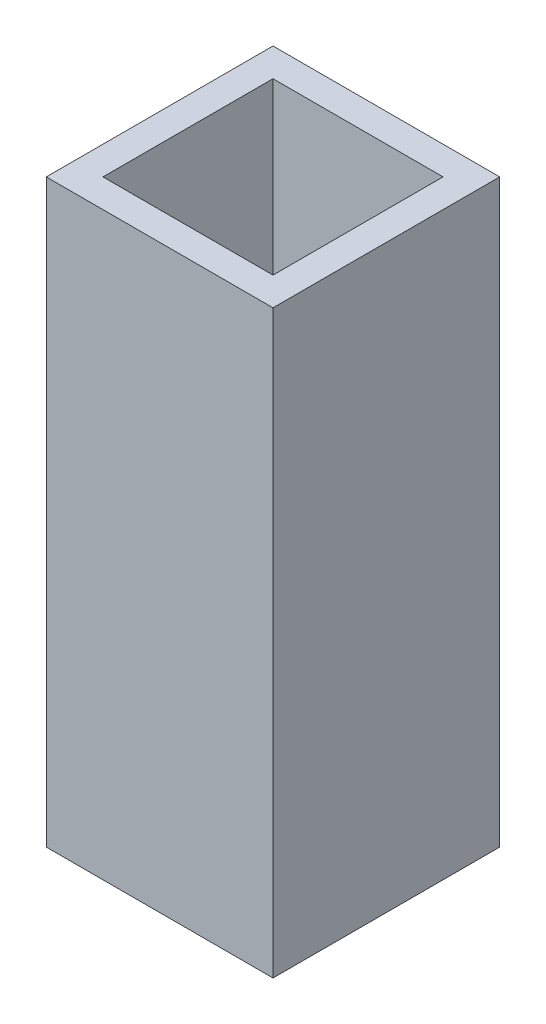
ISO-10303-21;
HEADER;
FILE_DESCRIPTION(('STEP AP214'),'2;1');
FILE_NAME('part.step','',(''),(''),'','','');
FILE_SCHEMA(('AUTOMOTIVE_DESIGN { 1 0 10303 214 1 1 1 1 }'));
ENDSEC;
DATA;
#1=APPLICATION_CONTEXT('core data for automotive mechanical design processes');
#2=APPLICATION_PROTOCOL_DEFINITION('international standard','automotive_design',2000,#1);
#3=PRODUCT_CONTEXT('',#1,'mechanical');
#4=PRODUCT('Part','Part','',(#3));
#5=PRODUCT_RELATED_PRODUCT_CATEGORY('part','',(#4));
#6=PRODUCT_DEFINITION_FORMATION('','',#4);
#7=PRODUCT_DEFINITION_CONTEXT('part definition',#1,'design');
#8=PRODUCT_DEFINITION('design','',#6,#7);
#9=PRODUCT_DEFINITION_SHAPE('','',#8);
#10=(LENGTH_UNIT() NAMED_UNIT(*) SI_UNIT(.MILLI.,.METRE.));
#11=(NAMED_UNIT(*) PLANE_ANGLE_UNIT() SI_UNIT($,.RADIAN.));
#12=(NAMED_UNIT(*) SI_UNIT($,.STERADIAN.) SOLID_ANGLE_UNIT());
#13=UNCERTAINTY_MEASURE_WITH_UNIT(LENGTH_MEASURE(1.E-05),#10,'distance_accuracy_value','');
#14=(GEOMETRIC_REPRESENTATION_CONTEXT(3) GLOBAL_UNCERTAINTY_ASSIGNED_CONTEXT((#13)) GLOBAL_UNIT_ASSIGNED_CONTEXT((#10,
#11,#12)) REPRESENTATION_CONTEXT('',''));
#15=CARTESIAN_POINT('',(0.,0.,0.));
#16=DIRECTION('',(0.,0.,1.));
#17=DIRECTION('',(1.,0.,0.));
#18=AXIS2_PLACEMENT_3D('',#15,#16,#17);
#19=CARTESIAN_POINT('',(0.,65.0240000000001,0.));
#20=DIRECTION('',(1.,0.,0.));
#21=DIRECTION('',(0.,0.,-1.));
#22=AXIS2_PLACEMENT_3D('',#19,#20,#21);
#23=PLANE('',#22);
#24=DIRECTION('',(0.,0.,1.));
#25=VECTOR('',#24,1.);
#26=CARTESIAN_POINT('',(0.,0.,0.));
#27=LINE('',#26,#25);
#28=CARTESIAN_POINT('',(0.,0.,-25.4));
#29=VERTEX_POINT('',#28);
#30=CARTESIAN_POINT('',(0.,0.,0.));
#31=VERTEX_POINT('',#30);
#32=EDGE_CURVE('E160',#29,#31,#27,.T.);
#33=ORIENTED_EDGE('',*,*,#32,.T.);
#34=DIRECTION('',(0.,-1.,0.));
#35=VECTOR('',#34,1.);
#36=CARTESIAN_POINT('',(0.,65.0240000000001,0.));
#37=LINE('',#36,#35);
#38=CARTESIAN_POINT('',(0.,65.0240000000001,0.));
#39=VERTEX_POINT('',#38);
#40=EDGE_CURVE('E11',#39,#31,#37,.T.);
#41=ORIENTED_EDGE('',*,*,#40,.F.);
#42=DIRECTION('',(0.,0.,1.));
#43=VECTOR('',#42,1.);
#44=CARTESIAN_POINT('',(0.,65.0240000000001,0.));
#45=LINE('',#44,#43);
#46=CARTESIAN_POINT('',(0.,65.0240000000001,-25.4));
#47=VERTEX_POINT('',#46);
#48=EDGE_CURVE('E166',#47,#39,#45,.T.);
#49=ORIENTED_EDGE('',*,*,#48,.F.);
#50=DIRECTION('',(0.,-1.,0.));
#51=VECTOR('',#50,1.);
#52=CARTESIAN_POINT('',(0.,65.0240000000001,-25.4));
#53=LINE('',#52,#51);
#54=EDGE_CURVE('E179',#47,#29,#53,.T.);
#55=ORIENTED_EDGE('',*,*,#54,.T.);
#56=EDGE_LOOP('',(#33,#41,#49,#55));
#57=FACE_BOUND('',#56,.T.);
#58=ADVANCED_FACE('F41',(#57),#23,.F.);
#59=CARTESIAN_POINT('',(0.,65.0240000000001,0.));
#60=DIRECTION('',(0.,0.,-1.));
#61=DIRECTION('',(-1.,0.,0.));
#62=AXIS2_PLACEMENT_3D('',#59,#60,#61);
#63=PLANE('',#62);
#64=DIRECTION('',(1.,0.,0.));
#65=VECTOR('',#64,1.);
#66=CARTESIAN_POINT('',(0.,0.,0.));
#67=LINE('',#66,#65);
#68=CARTESIAN_POINT('',(25.4,0.,0.));
#69=VERTEX_POINT('',#68);
#70=EDGE_CURVE('E183',#31,#69,#67,.T.);
#71=ORIENTED_EDGE('',*,*,#70,.T.);
#72=DIRECTION('',(0.,-1.,0.));
#73=VECTOR('',#72,1.);
#74=CARTESIAN_POINT('',(25.4,65.024,0.));
#75=LINE('',#74,#73);
#76=CARTESIAN_POINT('',(25.4,65.024,0.));
#77=VERTEX_POINT('',#76);
#78=EDGE_CURVE('E49',#77,#69,#75,.T.);
#79=ORIENTED_EDGE('',*,*,#78,.F.);
#80=DIRECTION('',(1.,0.,0.));
#81=VECTOR('',#80,1.);
#82=CARTESIAN_POINT('',(0.,65.0240000000001,0.));
#83=LINE('',#82,#81);
#84=EDGE_CURVE('E170',#39,#77,#83,.T.);
#85=ORIENTED_EDGE('',*,*,#84,.F.);
#86=ORIENTED_EDGE('',*,*,#40,.T.);
#87=EDGE_LOOP('',(#71,#79,#85,#86));
#88=FACE_BOUND('',#87,.T.);
#89=ADVANCED_FACE('F217',(#88),#63,.F.);
#90=CARTESIAN_POINT('',(25.4,65.024,0.));
#91=DIRECTION('',(-1.,0.,0.));
#92=DIRECTION('',(0.,0.,1.));
#93=AXIS2_PLACEMENT_3D('',#90,#91,#92);
#94=PLANE('',#93);
#95=DIRECTION('',(0.,0.,-1.));
#96=VECTOR('',#95,1.);
#97=CARTESIAN_POINT('',(25.4,0.,0.));
#98=LINE('',#97,#96);
#99=CARTESIAN_POINT('',(25.4,0.,-25.4));
#100=VERTEX_POINT('',#99);
#101=EDGE_CURVE('E186',#69,#100,#98,.T.);
#102=ORIENTED_EDGE('',*,*,#101,.T.);
#103=DIRECTION('',(0.,-1.,0.));
#104=VECTOR('',#103,1.);
#105=CARTESIAN_POINT('',(25.4,65.024,-25.4));
#106=LINE('',#105,#104);
#107=CARTESIAN_POINT('',(25.4,65.024,-25.4));
#108=VERTEX_POINT('',#107);
#109=EDGE_CURVE('E194',#108,#100,#106,.T.);
#110=ORIENTED_EDGE('',*,*,#109,.F.);
#111=DIRECTION('',(0.,0.,-1.));
#112=VECTOR('',#111,1.);
#113=CARTESIAN_POINT('',(25.4,65.024,0.));
#114=LINE('',#113,#112);
#115=EDGE_CURVE('E173',#77,#108,#114,.T.);
#116=ORIENTED_EDGE('',*,*,#115,.F.);
#117=ORIENTED_EDGE('',*,*,#78,.T.);
#118=EDGE_LOOP('',(#102,#110,#116,#117));
#119=FACE_BOUND('',#118,.T.);
#120=ADVANCED_FACE('F203',(#119),#94,.F.);
#121=CARTESIAN_POINT('',(0.,65.0240000000001,-25.4));
#122=DIRECTION('',(0.,0.,1.));
#123=DIRECTION('',(1.,0.,0.));
#124=AXIS2_PLACEMENT_3D('',#121,#122,#123);
#125=PLANE('',#124);
#126=DIRECTION('',(-1.,0.,0.));
#127=VECTOR('',#126,1.);
#128=CARTESIAN_POINT('',(0.,0.,-25.4));
#129=LINE('',#128,#127);
#130=EDGE_CURVE('E171',#100,#29,#129,.T.);
#131=ORIENTED_EDGE('',*,*,#130,.T.);
#132=ORIENTED_EDGE('',*,*,#54,.F.);
#133=DIRECTION('',(-1.,0.,0.));
#134=VECTOR('',#133,1.);
#135=CARTESIAN_POINT('',(0.,65.0240000000001,-25.4));
#136=LINE('',#135,#134);
#137=EDGE_CURVE('E176',#108,#47,#136,.T.);
#138=ORIENTED_EDGE('',*,*,#137,.F.);
#139=ORIENTED_EDGE('',*,*,#109,.T.);
#140=EDGE_LOOP('',(#131,#132,#138,#139));
#141=FACE_BOUND('',#140,.T.);
#142=ADVANCED_FACE('F212',(#141),#125,.F.);
#143=CARTESIAN_POINT('',(0.,65.0240000000001,0.));
#144=DIRECTION('',(0.,-1.,0.));
#145=DIRECTION('',(0.,0.,-1.));
#146=AXIS2_PLACEMENT_3D('',#143,#144,#145);
#147=PLANE('',#146);
#148=DIRECTION('',(1.,0.,0.));
#149=VECTOR('',#148,1.);
#150=CARTESIAN_POINT('',(22.225,65.024,-22.225));
#151=LINE('',#150,#149);
#152=CARTESIAN_POINT('',(3.17499999999991,65.0240000000001,-22.225));
#153=VERTEX_POINT('',#152);
#154=CARTESIAN_POINT('',(22.225,65.024,-22.225));
#155=VERTEX_POINT('',#154);
#156=EDGE_CURVE('E127',#153,#155,#151,.T.);
#157=ORIENTED_EDGE('',*,*,#156,.T.);
#158=DIRECTION('',(0.,0.,1.));
#159=VECTOR('',#158,1.);
#160=CARTESIAN_POINT('',(22.225,65.024,-3.17500000000001));
#161=LINE('',#160,#159);
#162=CARTESIAN_POINT('',(22.225,65.024,-3.17500000000001));
#163=VERTEX_POINT('',#162);
#164=EDGE_CURVE('E120',#155,#163,#161,.T.);
#165=ORIENTED_EDGE('',*,*,#164,.T.);
#166=DIRECTION('',(-1.,0.,0.));
#167=VECTOR('',#166,1.);
#168=CARTESIAN_POINT('',(22.225,65.024,-3.17500000000001));
#169=LINE('',#168,#167);
#170=CARTESIAN_POINT('',(3.17499999999998,65.024,-3.17500000000001));
#171=VERTEX_POINT('',#170);
#172=EDGE_CURVE('E130',#163,#171,#169,.T.);
#173=ORIENTED_EDGE('',*,*,#172,.T.);
#174=DIRECTION('',(0.,0.,-1.));
#175=VECTOR('',#174,1.);
#176=CARTESIAN_POINT('',(3.17499999999998,65.024,-3.17500000000001));
#177=LINE('',#176,#175);
#178=EDGE_CURVE('E56',#171,#153,#177,.T.);
#179=ORIENTED_EDGE('',*,*,#178,.T.);
#180=EDGE_LOOP('',(#157,#165,#173,#179));
#181=FACE_BOUND('',#180,.T.);
#182=ORIENTED_EDGE('',*,*,#48,.T.);
#183=ORIENTED_EDGE('',*,*,#84,.T.);
#184=ORIENTED_EDGE('',*,*,#115,.T.);
#185=ORIENTED_EDGE('',*,*,#137,.T.);
#186=EDGE_LOOP('',(#182,#183,#184,#185));
#187=FACE_BOUND('',#186,.T.);
#188=ADVANCED_FACE('F134',(#181,#187),#147,.F.);
#189=CARTESIAN_POINT('',(0.,0.,0.));
#190=DIRECTION('',(0.,-1.,0.));
#191=DIRECTION('',(0.,0.,-1.));
#192=AXIS2_PLACEMENT_3D('',#189,#190,#191);
#193=PLANE('',#192);
#194=DIRECTION('',(0.,0.,1.));
#195=VECTOR('',#194,1.);
#196=CARTESIAN_POINT('',(22.225,0.,-3.175));
#197=LINE('',#196,#195);
#198=CARTESIAN_POINT('',(22.225,0.,-22.225));
#199=VERTEX_POINT('',#198);
#200=CARTESIAN_POINT('',(22.225,0.,-3.175));
#201=VERTEX_POINT('',#200);
#202=EDGE_CURVE('E67',#199,#201,#197,.T.);
#203=ORIENTED_EDGE('',*,*,#202,.F.);
#204=DIRECTION('',(1.,0.,0.));
#205=VECTOR('',#204,1.);
#206=CARTESIAN_POINT('',(22.225,0.,-22.225));
#207=LINE('',#206,#205);
#208=CARTESIAN_POINT('',(3.175,0.,-22.225));
#209=VERTEX_POINT('',#208);
#210=EDGE_CURVE('E138',#209,#199,#207,.T.);
#211=ORIENTED_EDGE('',*,*,#210,.F.);
#212=DIRECTION('',(0.,0.,-1.));
#213=VECTOR('',#212,1.);
#214=CARTESIAN_POINT('',(3.175,0.,-3.17499999999998));
#215=LINE('',#214,#213);
#216=CARTESIAN_POINT('',(3.175,0.,-3.17499999999998));
#217=VERTEX_POINT('',#216);
#218=EDGE_CURVE('E144',#217,#209,#215,.T.);
#219=ORIENTED_EDGE('',*,*,#218,.F.);
#220=DIRECTION('',(-1.,0.,0.));
#221=VECTOR('',#220,1.);
#222=CARTESIAN_POINT('',(22.225,0.,-3.175));
#223=LINE('',#222,#221);
#224=EDGE_CURVE('E151',#201,#217,#223,.T.);
#225=ORIENTED_EDGE('',*,*,#224,.F.);
#226=EDGE_LOOP('',(#203,#211,#219,#225));
#227=FACE_BOUND('',#226,.T.);
#228=ORIENTED_EDGE('',*,*,#32,.F.);
#229=ORIENTED_EDGE('',*,*,#130,.F.);
#230=ORIENTED_EDGE('',*,*,#101,.F.);
#231=ORIENTED_EDGE('',*,*,#70,.F.);
#232=EDGE_LOOP('',(#228,#229,#230,#231));
#233=FACE_BOUND('',#232,.T.);
#234=ADVANCED_FACE('F209',(#227,#233),#193,.T.);
#235=CARTESIAN_POINT('',(22.225,65.024,-3.17500000000001));
#236=DIRECTION('',(1.,0.,0.));
#237=DIRECTION('',(0.,0.,-1.));
#238=AXIS2_PLACEMENT_3D('',#235,#236,#237);
#239=PLANE('',#238);
#240=ORIENTED_EDGE('',*,*,#202,.T.);
#241=DIRECTION('',(0.,-1.,0.));
#242=VECTOR('',#241,1.);
#243=CARTESIAN_POINT('',(22.225,65.024,-3.17500000000001));
#244=LINE('',#243,#242);
#245=EDGE_CURVE('E116',#163,#201,#244,.T.);
#246=ORIENTED_EDGE('',*,*,#245,.F.);
#247=ORIENTED_EDGE('',*,*,#164,.F.);
#248=DIRECTION('',(0.,-1.,0.));
#249=VECTOR('',#248,1.);
#250=CARTESIAN_POINT('',(22.225,65.024,-22.225));
#251=LINE('',#250,#249);
#252=EDGE_CURVE('E157',#155,#199,#251,.T.);
#253=ORIENTED_EDGE('',*,*,#252,.T.);
#254=EDGE_LOOP('',(#240,#246,#247,#253));
#255=FACE_BOUND('',#254,.T.);
#256=ADVANCED_FACE('F118',(#255),#239,.F.);
#257=CARTESIAN_POINT('',(22.225,65.024,-22.225));
#258=DIRECTION('',(0.,0.,-1.));
#259=DIRECTION('',(-1.,0.,0.));
#260=AXIS2_PLACEMENT_3D('',#257,#258,#259);
#261=PLANE('',#260);
#262=ORIENTED_EDGE('',*,*,#210,.T.);
#263=ORIENTED_EDGE('',*,*,#252,.F.);
#264=ORIENTED_EDGE('',*,*,#156,.F.);
#265=DIRECTION('',(0.,-1.,0.));
#266=VECTOR('',#265,1.);
#267=CARTESIAN_POINT('',(3.17499999999991,65.0240000000001,-22.225));
#268=LINE('',#267,#266);
#269=EDGE_CURVE('E161',#153,#209,#268,.T.);
#270=ORIENTED_EDGE('',*,*,#269,.T.);
#271=EDGE_LOOP('',(#262,#263,#264,#270));
#272=FACE_BOUND('',#271,.T.);
#273=ADVANCED_FACE('F234',(#272),#261,.F.);
#274=CARTESIAN_POINT('',(3.17499999999998,65.024,-3.17500000000001));
#275=DIRECTION('',(-1.,0.,0.));
#276=DIRECTION('',(0.,0.,1.));
#277=AXIS2_PLACEMENT_3D('',#274,#275,#276);
#278=PLANE('',#277);
#279=ORIENTED_EDGE('',*,*,#218,.T.);
#280=ORIENTED_EDGE('',*,*,#269,.F.);
#281=ORIENTED_EDGE('',*,*,#178,.F.);
#282=DIRECTION('',(0.,-1.,0.));
#283=VECTOR('',#282,1.);
#284=CARTESIAN_POINT('',(3.17499999999998,65.024,-3.17500000000001));
#285=LINE('',#284,#283);
#286=EDGE_CURVE('E126',#171,#217,#285,.T.);
#287=ORIENTED_EDGE('',*,*,#286,.T.);
#288=EDGE_LOOP('',(#279,#280,#281,#287));
#289=FACE_BOUND('',#288,.T.);
#290=ADVANCED_FACE('F237',(#289),#278,.F.);
#291=CARTESIAN_POINT('',(22.225,65.024,-3.17500000000001));
#292=DIRECTION('',(0.,0.,1.));
#293=DIRECTION('',(1.,0.,0.));
#294=AXIS2_PLACEMENT_3D('',#291,#292,#293);
#295=PLANE('',#294);
#296=ORIENTED_EDGE('',*,*,#224,.T.);
#297=ORIENTED_EDGE('',*,*,#286,.F.);
#298=ORIENTED_EDGE('',*,*,#172,.F.);
#299=ORIENTED_EDGE('',*,*,#245,.T.);
#300=EDGE_LOOP('',(#296,#297,#298,#299));
#301=FACE_BOUND('',#300,.T.);
#302=ADVANCED_FACE('F131',(#301),#295,.F.);
#303=CLOSED_SHELL('',(#58,#89,#120,#142,#188,#234,#256,#273,#290,#302));
#304=MANIFOLD_SOLID_BREP('B2',#303);
#305=ADVANCED_BREP_SHAPE_REPRESENTATION('',(#18,#304),#14);
#306=SHAPE_DEFINITION_REPRESENTATION(#9,#305);
ENDSEC;
END-ISO-10303-21;
